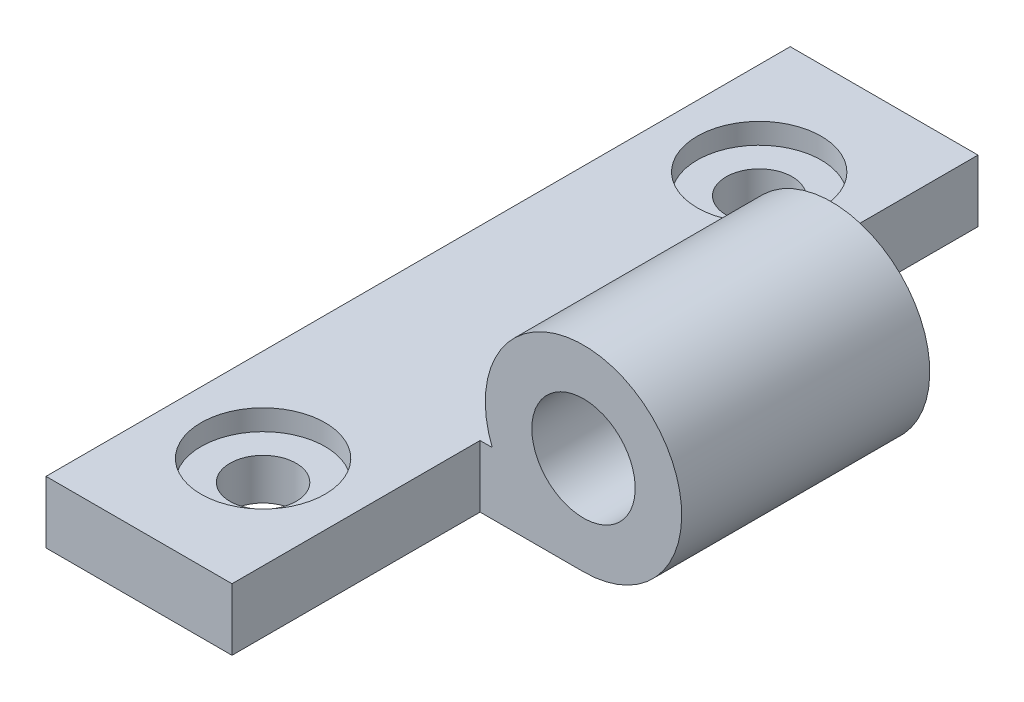
ISO-10303-21;
HEADER;
FILE_DESCRIPTION(('STEP AP214'),'2;1');
FILE_NAME('part.step','',(''),(''),'','','');
FILE_SCHEMA(('AUTOMOTIVE_DESIGN { 1 0 10303 214 1 1 1 1 }'));
ENDSEC;
DATA;
#1=APPLICATION_CONTEXT('core data for automotive mechanical design processes');
#2=APPLICATION_PROTOCOL_DEFINITION('international standard','automotive_design',2000,#1);
#3=PRODUCT_CONTEXT('',#1,'mechanical');
#4=PRODUCT('Part','Part','',(#3));
#5=PRODUCT_RELATED_PRODUCT_CATEGORY('part','',(#4));
#6=PRODUCT_DEFINITION_FORMATION('','',#4);
#7=PRODUCT_DEFINITION_CONTEXT('part definition',#1,'design');
#8=PRODUCT_DEFINITION('design','',#6,#7);
#9=PRODUCT_DEFINITION_SHAPE('','',#8);
#10=(LENGTH_UNIT() NAMED_UNIT(*) SI_UNIT(.MILLI.,.METRE.));
#11=(NAMED_UNIT(*) PLANE_ANGLE_UNIT() SI_UNIT($,.RADIAN.));
#12=(NAMED_UNIT(*) SI_UNIT($,.STERADIAN.) SOLID_ANGLE_UNIT());
#13=UNCERTAINTY_MEASURE_WITH_UNIT(LENGTH_MEASURE(1.E-05),#10,'distance_accuracy_value','');
#14=(GEOMETRIC_REPRESENTATION_CONTEXT(3) GLOBAL_UNCERTAINTY_ASSIGNED_CONTEXT((#13)) GLOBAL_UNIT_ASSIGNED_CONTEXT((#10,
#11,#12)) REPRESENTATION_CONTEXT('',''));
#15=CARTESIAN_POINT('',(0.,0.,0.));
#16=DIRECTION('',(0.,0.,1.));
#17=DIRECTION('',(1.,0.,0.));
#18=AXIS2_PLACEMENT_3D('',#15,#16,#17);
#19=CARTESIAN_POINT('',(0.,3.,0.));
#20=DIRECTION('',(0.,1.,0.));
#21=DIRECTION('',(0.,0.,1.));
#22=AXIS2_PLACEMENT_3D('',#19,#20,#21);
#23=PLANE('',#22);
#24=DIRECTION('',(0.,0.,1.));
#25=VECTOR('',#24,1.);
#26=CARTESIAN_POINT('',(8.99755402302062,3.,0.));
#27=LINE('',#26,#25);
#28=CARTESIAN_POINT('',(8.99755402302062,3.,24.));
#29=VERTEX_POINT('',#28);
#30=CARTESIAN_POINT('',(8.99755402302062,3.,36.));
#31=VERTEX_POINT('',#30);
#32=EDGE_CURVE('E132',#29,#31,#27,.T.);
#33=ORIENTED_EDGE('',*,*,#32,.F.);
#34=DIRECTION('',(-1.,0.,0.));
#35=VECTOR('',#34,1.);
#36=CARTESIAN_POINT('',(0.,3.,24.));
#37=LINE('',#36,#35);
#38=CARTESIAN_POINT('',(9.58411956683608,3.,24.));
#39=VERTEX_POINT('',#38);
#40=EDGE_CURVE('E121',#39,#29,#37,.T.);
#41=ORIENTED_EDGE('',*,*,#40,.F.);
#42=DIRECTION('',(0.,0.,-1.));
#43=VECTOR('',#42,1.);
#44=CARTESIAN_POINT('',(9.58411956683608,3.,24.));
#45=LINE('',#44,#43);
#46=CARTESIAN_POINT('',(9.58411956683608,3.,12.));
#47=VERTEX_POINT('',#46);
#48=EDGE_CURVE('E162',#47,#39,#45,.F.);
#49=ORIENTED_EDGE('',*,*,#48,.F.);
#50=DIRECTION('',(1.,0.,0.));
#51=VECTOR('',#50,1.);
#52=CARTESIAN_POINT('',(0.,3.,12.));
#53=LINE('',#52,#51);
#54=CARTESIAN_POINT('',(9.08281417427322,3.,12.));
#55=VERTEX_POINT('',#54);
#56=EDGE_CURVE('E149',#55,#47,#53,.T.);
#57=ORIENTED_EDGE('',*,*,#56,.F.);
#58=DIRECTION('',(0.,0.,1.));
#59=VECTOR('',#58,1.);
#60=CARTESIAN_POINT('',(9.08281417427322,3.,0.));
#61=LINE('',#60,#59);
#62=CARTESIAN_POINT('',(9.08281417427322,3.,0.));
#63=VERTEX_POINT('',#62);
#64=EDGE_CURVE('E155',#63,#55,#61,.T.);
#65=ORIENTED_EDGE('',*,*,#64,.F.);
#66=DIRECTION('',(-1.,0.,0.));
#67=VECTOR('',#66,1.);
#68=CARTESIAN_POINT('',(0.,3.,0.));
#69=LINE('',#68,#67);
#70=CARTESIAN_POINT('',(0.,3.,0.));
#71=VERTEX_POINT('',#70);
#72=EDGE_CURVE('E67',#63,#71,#69,.T.);
#73=ORIENTED_EDGE('',*,*,#72,.T.);
#74=DIRECTION('',(0.,0.,1.));
#75=VECTOR('',#74,1.);
#76=CARTESIAN_POINT('',(0.,3.,0.));
#77=LINE('',#76,#75);
#78=CARTESIAN_POINT('',(0.,3.,36.));
#79=VERTEX_POINT('',#78);
#80=EDGE_CURVE('E178',#71,#79,#77,.T.);
#81=ORIENTED_EDGE('',*,*,#80,.T.);
#82=DIRECTION('',(1.,0.,0.));
#83=VECTOR('',#82,1.);
#84=CARTESIAN_POINT('',(0.,3.,36.));
#85=LINE('',#84,#83);
#86=EDGE_CURVE('E142',#79,#31,#85,.T.);
#87=ORIENTED_EDGE('',*,*,#86,.T.);
#88=EDGE_LOOP('',(#33,#41,#49,#57,#65,#73,#81,#87));
#89=FACE_BOUND('',#88,.T.);
#90=CARTESIAN_POINT('',(4.5,3.,6.));
#91=DIRECTION('',(0.,1.,0.));
#92=DIRECTION('',(0.,0.,1.));
#93=AXIS2_PLACEMENT_3D('',#90,#91,#92);
#94=CIRCLE('',#93,3.);
#95=CARTESIAN_POINT('',(4.5,3.,9.));
#96=VERTEX_POINT('',#95);
#97=EDGE_CURVE('E170',#96,#96,#94,.T.);
#98=ORIENTED_EDGE('',*,*,#97,.F.);
#99=EDGE_LOOP('',(#98));
#100=FACE_BOUND('',#99,.T.);
#101=CARTESIAN_POINT('',(4.5,3.,30.));
#102=DIRECTION('',(0.,1.,0.));
#103=DIRECTION('',(0.,0.,1.));
#104=AXIS2_PLACEMENT_3D('',#101,#102,#103);
#105=CIRCLE('',#104,3.);
#106=CARTESIAN_POINT('',(4.5,3.,33.));
#107=VERTEX_POINT('',#106);
#108=EDGE_CURVE('E165',#107,#107,#105,.T.);
#109=ORIENTED_EDGE('',*,*,#108,.F.);
#110=EDGE_LOOP('',(#109));
#111=FACE_BOUND('',#110,.T.);
#112=ADVANCED_FACE('F50',(#89,#100,#111),#23,.T.);
#113=CARTESIAN_POINT('',(4.5,-7.00000000000003,30.));
#114=DIRECTION('',(0.,1.,0.));
#115=DIRECTION('',(0.,0.,1.));
#116=AXIS2_PLACEMENT_3D('',#113,#114,#115);
#117=CYLINDRICAL_SURFACE('',#116,1.6);
#118=CARTESIAN_POINT('',(4.5,0.,30.));
#119=DIRECTION('',(0.,1.,0.));
#120=DIRECTION('',(0.,0.,1.));
#121=AXIS2_PLACEMENT_3D('',#118,#119,#120);
#122=CIRCLE('',#121,1.6);
#123=CARTESIAN_POINT('',(4.5,0.,31.6));
#124=VERTEX_POINT('',#123);
#125=EDGE_CURVE('E198',#124,#124,#122,.T.);
#126=ORIENTED_EDGE('',*,*,#125,.F.);
#127=EDGE_LOOP('',(#126));
#128=FACE_BOUND('',#127,.T.);
#129=CARTESIAN_POINT('',(4.5,2.,30.));
#130=DIRECTION('',(0.,1.,0.));
#131=DIRECTION('',(0.,0.,1.));
#132=AXIS2_PLACEMENT_3D('',#129,#130,#131);
#133=CIRCLE('',#132,1.6);
#134=CARTESIAN_POINT('',(4.5,2.,31.6));
#135=VERTEX_POINT('',#134);
#136=EDGE_CURVE('E201',#135,#135,#133,.F.);
#137=ORIENTED_EDGE('',*,*,#136,.F.);
#138=EDGE_LOOP('',(#137));
#139=FACE_BOUND('',#138,.T.);
#140=ADVANCED_FACE('F247',(#128,#139),#117,.F.);
#141=CARTESIAN_POINT('',(4.5,-7.00000000000003,6.));
#142=DIRECTION('',(0.,1.,0.));
#143=DIRECTION('',(0.,0.,1.));
#144=AXIS2_PLACEMENT_3D('',#141,#142,#143);
#145=CYLINDRICAL_SURFACE('',#144,1.6);
#146=CARTESIAN_POINT('',(4.5,0.,6.));
#147=DIRECTION('',(0.,1.,0.));
#148=DIRECTION('',(0.,0.,1.));
#149=AXIS2_PLACEMENT_3D('',#146,#147,#148);
#150=CIRCLE('',#149,1.6);
#151=CARTESIAN_POINT('',(4.5,0.,7.6));
#152=VERTEX_POINT('',#151);
#153=EDGE_CURVE('E187',#152,#152,#150,.T.);
#154=ORIENTED_EDGE('',*,*,#153,.F.);
#155=EDGE_LOOP('',(#154));
#156=FACE_BOUND('',#155,.T.);
#157=CARTESIAN_POINT('',(4.5,2.,6.));
#158=DIRECTION('',(0.,1.,0.));
#159=DIRECTION('',(0.,0.,1.));
#160=AXIS2_PLACEMENT_3D('',#157,#158,#159);
#161=CIRCLE('',#160,1.6);
#162=CARTESIAN_POINT('',(4.5,2.,7.6));
#163=VERTEX_POINT('',#162);
#164=EDGE_CURVE('E169',#163,#163,#161,.F.);
#165=ORIENTED_EDGE('',*,*,#164,.F.);
#166=EDGE_LOOP('',(#165));
#167=FACE_BOUND('',#166,.T.);
#168=ADVANCED_FACE('F252',(#156,#167),#145,.F.);
#169=CARTESIAN_POINT('',(0.,3.,0.));
#170=DIRECTION('',(1.,0.,0.));
#171=DIRECTION('',(0.,0.,-1.));
#172=AXIS2_PLACEMENT_3D('',#169,#170,#171);
#173=PLANE('',#172);
#174=DIRECTION('',(0.,0.,1.));
#175=VECTOR('',#174,1.);
#176=CARTESIAN_POINT('',(0.,0.,0.));
#177=LINE('',#176,#175);
#178=CARTESIAN_POINT('',(0.,0.,0.));
#179=VERTEX_POINT('',#178);
#180=CARTESIAN_POINT('',(0.,0.,36.));
#181=VERTEX_POINT('',#180);
#182=EDGE_CURVE('E184',#179,#181,#177,.T.);
#183=ORIENTED_EDGE('',*,*,#182,.T.);
#184=DIRECTION('',(0.,-1.,0.));
#185=VECTOR('',#184,1.);
#186=CARTESIAN_POINT('',(0.,3.,36.));
#187=LINE('',#186,#185);
#188=EDGE_CURVE('E195',#79,#181,#187,.T.);
#189=ORIENTED_EDGE('',*,*,#188,.F.);
#190=ORIENTED_EDGE('',*,*,#80,.F.);
#191=DIRECTION('',(0.,-1.,0.));
#192=VECTOR('',#191,1.);
#193=CARTESIAN_POINT('',(0.,3.,0.));
#194=LINE('',#193,#192);
#195=EDGE_CURVE('E183',#71,#179,#194,.T.);
#196=ORIENTED_EDGE('',*,*,#195,.T.);
#197=EDGE_LOOP('',(#183,#189,#190,#196));
#198=FACE_BOUND('',#197,.T.);
#199=ADVANCED_FACE('F52',(#198),#173,.F.);
#200=CARTESIAN_POINT('',(0.,3.,36.));
#201=DIRECTION('',(0.,0.,-1.));
#202=DIRECTION('',(-1.,0.,0.));
#203=AXIS2_PLACEMENT_3D('',#200,#201,#202);
#204=PLANE('',#203);
#205=DIRECTION('',(1.,0.,0.));
#206=VECTOR('',#205,1.);
#207=CARTESIAN_POINT('',(0.,0.,36.));
#208=LINE('',#207,#206);
#209=CARTESIAN_POINT('',(8.99755402302062,0.,36.));
#210=VERTEX_POINT('',#209);
#211=EDGE_CURVE('E78',#181,#210,#208,.T.);
#212=ORIENTED_EDGE('',*,*,#211,.T.);
#213=DIRECTION('',(0.,-1.,0.));
#214=VECTOR('',#213,1.);
#215=CARTESIAN_POINT('',(8.99755402302062,4.60957170836924,36.));
#216=LINE('',#215,#214);
#217=EDGE_CURVE('E138',#31,#210,#216,.T.);
#218=ORIENTED_EDGE('',*,*,#217,.F.);
#219=ORIENTED_EDGE('',*,*,#86,.F.);
#220=ORIENTED_EDGE('',*,*,#188,.T.);
#221=EDGE_LOOP('',(#212,#218,#219,#220));
#222=FACE_BOUND('',#221,.T.);
#223=ADVANCED_FACE('F221',(#222),#204,.F.);
#224=CARTESIAN_POINT('',(0.,3.,0.));
#225=DIRECTION('',(0.,0.,1.));
#226=DIRECTION('',(1.,0.,0.));
#227=AXIS2_PLACEMENT_3D('',#224,#225,#226);
#228=PLANE('',#227);
#229=ORIENTED_EDGE('',*,*,#72,.F.);
#230=DIRECTION('',(0.,1.,0.));
#231=VECTOR('',#230,1.);
#232=CARTESIAN_POINT('',(9.08281417427322,-1.93524382816757,0.));
#233=LINE('',#232,#231);
#234=CARTESIAN_POINT('',(9.08281417427322,0.,0.));
#235=VERTEX_POINT('',#234);
#236=EDGE_CURVE('E87',#235,#63,#233,.T.);
#237=ORIENTED_EDGE('',*,*,#236,.F.);
#238=DIRECTION('',(-1.,0.,0.));
#239=VECTOR('',#238,1.);
#240=CARTESIAN_POINT('',(0.,0.,0.));
#241=LINE('',#240,#239);
#242=EDGE_CURVE('E180',#235,#179,#241,.T.);
#243=ORIENTED_EDGE('',*,*,#242,.T.);
#244=ORIENTED_EDGE('',*,*,#195,.F.);
#245=EDGE_LOOP('',(#229,#237,#243,#244));
#246=FACE_BOUND('',#245,.T.);
#247=ADVANCED_FACE('F216',(#246),#228,.F.);
#248=CARTESIAN_POINT('',(0.,0.,0.));
#249=DIRECTION('',(0.,1.,0.));
#250=DIRECTION('',(0.,0.,1.));
#251=AXIS2_PLACEMENT_3D('',#248,#249,#250);
#252=PLANE('',#251);
#253=ORIENTED_EDGE('',*,*,#153,.T.);
#254=EDGE_LOOP('',(#253));
#255=FACE_BOUND('',#254,.T.);
#256=ORIENTED_EDGE('',*,*,#125,.T.);
#257=EDGE_LOOP('',(#256));
#258=FACE_BOUND('',#257,.T.);
#259=DIRECTION('',(-1.,0.,0.));
#260=VECTOR('',#259,1.);
#261=CARTESIAN_POINT('',(0.,0.,24.));
#262=LINE('',#261,#260);
#263=CARTESIAN_POINT('',(14.,0.,24.));
#264=VERTEX_POINT('',#263);
#265=CARTESIAN_POINT('',(8.99755402302062,0.,24.));
#266=VERTEX_POINT('',#265);
#267=EDGE_CURVE('E133',#264,#266,#262,.T.);
#268=ORIENTED_EDGE('',*,*,#267,.T.);
#269=DIRECTION('',(0.,0.,1.));
#270=VECTOR('',#269,1.);
#271=CARTESIAN_POINT('',(8.99755402302062,0.,0.));
#272=LINE('',#271,#270);
#273=EDGE_CURVE('E13',#266,#210,#272,.T.);
#274=ORIENTED_EDGE('',*,*,#273,.T.);
#275=ORIENTED_EDGE('',*,*,#211,.F.);
#276=ORIENTED_EDGE('',*,*,#182,.F.);
#277=ORIENTED_EDGE('',*,*,#242,.F.);
#278=DIRECTION('',(0.,0.,1.));
#279=VECTOR('',#278,1.);
#280=CARTESIAN_POINT('',(9.08281417427322,0.,0.));
#281=LINE('',#280,#279);
#282=CARTESIAN_POINT('',(9.08281417427322,0.,12.));
#283=VERTEX_POINT('',#282);
#284=EDGE_CURVE('E59',#235,#283,#281,.T.);
#285=ORIENTED_EDGE('',*,*,#284,.T.);
#286=DIRECTION('',(1.,0.,0.));
#287=VECTOR('',#286,1.);
#288=CARTESIAN_POINT('',(0.,0.,12.));
#289=LINE('',#288,#287);
#290=CARTESIAN_POINT('',(14.,0.,12.));
#291=VERTEX_POINT('',#290);
#292=EDGE_CURVE('E152',#283,#291,#289,.T.);
#293=ORIENTED_EDGE('',*,*,#292,.T.);
#294=DIRECTION('',(0.,0.,-1.));
#295=VECTOR('',#294,1.);
#296=CARTESIAN_POINT('',(14.,0.,0.));
#297=LINE('',#296,#295);
#298=EDGE_CURVE('E189',#264,#291,#297,.T.);
#299=ORIENTED_EDGE('',*,*,#298,.F.);
#300=EDGE_LOOP('',(#268,#274,#275,#276,#277,#285,#293,#299));
#301=FACE_BOUND('',#300,.T.);
#302=ADVANCED_FACE('F211',(#255,#258,#301),#252,.F.);
#303=CARTESIAN_POINT('',(4.5,2.,6.));
#304=DIRECTION('',(0.,1.,0.));
#305=DIRECTION('',(0.,0.,1.));
#306=AXIS2_PLACEMENT_3D('',#303,#304,#305);
#307=PLANE('',#306);
#308=CARTESIAN_POINT('',(4.5,2.,6.));
#309=DIRECTION('',(0.,1.,0.));
#310=DIRECTION('',(0.,0.,1.));
#311=AXIS2_PLACEMENT_3D('',#308,#309,#310);
#312=CIRCLE('',#311,3.);
#313=CARTESIAN_POINT('',(4.5,2.,9.));
#314=VERTEX_POINT('',#313);
#315=EDGE_CURVE('E166',#314,#314,#312,.T.);
#316=ORIENTED_EDGE('',*,*,#315,.T.);
#317=EDGE_LOOP('',(#316));
#318=FACE_BOUND('',#317,.T.);
#319=ORIENTED_EDGE('',*,*,#164,.T.);
#320=EDGE_LOOP('',(#319));
#321=FACE_BOUND('',#320,.T.);
#322=ADVANCED_FACE('F259',(#318,#321),#307,.T.);
#323=CARTESIAN_POINT('',(4.5,2.,6.));
#324=DIRECTION('',(0.,1.,0.));
#325=DIRECTION('',(0.,0.,1.));
#326=AXIS2_PLACEMENT_3D('',#323,#324,#325);
#327=CYLINDRICAL_SURFACE('',#326,3.);
#328=ORIENTED_EDGE('',*,*,#315,.F.);
#329=EDGE_LOOP('',(#328));
#330=FACE_BOUND('',#329,.T.);
#331=ORIENTED_EDGE('',*,*,#97,.T.);
#332=EDGE_LOOP('',(#331));
#333=FACE_BOUND('',#332,.T.);
#334=ADVANCED_FACE('F282',(#330,#333),#327,.F.);
#335=CARTESIAN_POINT('',(4.5,2.,30.));
#336=DIRECTION('',(0.,1.,0.));
#337=DIRECTION('',(0.,0.,1.));
#338=AXIS2_PLACEMENT_3D('',#335,#336,#337);
#339=PLANE('',#338);
#340=CARTESIAN_POINT('',(4.5,2.,30.));
#341=DIRECTION('',(0.,1.,0.));
#342=DIRECTION('',(0.,0.,1.));
#343=AXIS2_PLACEMENT_3D('',#340,#341,#342);
#344=CIRCLE('',#343,3.);
#345=CARTESIAN_POINT('',(4.5,2.,33.));
#346=VERTEX_POINT('',#345);
#347=EDGE_CURVE('E173',#346,#346,#344,.T.);
#348=ORIENTED_EDGE('',*,*,#347,.T.);
#349=EDGE_LOOP('',(#348));
#350=FACE_BOUND('',#349,.T.);
#351=ORIENTED_EDGE('',*,*,#136,.T.);
#352=EDGE_LOOP('',(#351));
#353=FACE_BOUND('',#352,.T.);
#354=ADVANCED_FACE('F278',(#350,#353),#339,.T.);
#355=CARTESIAN_POINT('',(4.5,2.,30.));
#356=DIRECTION('',(0.,1.,0.));
#357=DIRECTION('',(0.,0.,1.));
#358=AXIS2_PLACEMENT_3D('',#355,#356,#357);
#359=CYLINDRICAL_SURFACE('',#358,3.);
#360=ORIENTED_EDGE('',*,*,#347,.F.);
#361=EDGE_LOOP('',(#360));
#362=FACE_BOUND('',#361,.T.);
#363=ORIENTED_EDGE('',*,*,#108,.T.);
#364=EDGE_LOOP('',(#363));
#365=FACE_BOUND('',#364,.T.);
#366=ADVANCED_FACE('F275',(#362,#365),#359,.F.);
#367=CARTESIAN_POINT('',(14.,4.75,24.));
#368=DIRECTION('',(0.,0.,-1.));
#369=DIRECTION('',(-1.,0.,0.));
#370=AXIS2_PLACEMENT_3D('',#367,#368,#369);
#371=PLANE('',#370);
#372=ORIENTED_EDGE('',*,*,#267,.F.);
#373=CARTESIAN_POINT('',(14.,4.75,24.));
#374=DIRECTION('',(0.,0.,-1.));
#375=DIRECTION('',(-1.,0.,0.));
#376=AXIS2_PLACEMENT_3D('',#373,#374,#375);
#377=CIRCLE('',#376,4.75);
#378=EDGE_CURVE('E128',#39,#264,#377,.T.);
#379=ORIENTED_EDGE('',*,*,#378,.F.);
#380=ORIENTED_EDGE('',*,*,#40,.T.);
#381=DIRECTION('',(0.,-1.,0.));
#382=VECTOR('',#381,1.);
#383=CARTESIAN_POINT('',(8.99755402302062,4.60957170836924,24.));
#384=LINE('',#383,#382);
#385=EDGE_CURVE('E126',#29,#266,#384,.T.);
#386=ORIENTED_EDGE('',*,*,#385,.T.);
#387=EDGE_LOOP('',(#372,#379,#380,#386));
#388=FACE_BOUND('',#387,.T.);
#389=CARTESIAN_POINT('',(14.,4.75,24.));
#390=DIRECTION('',(0.,0.,-1.));
#391=DIRECTION('',(-1.,0.,0.));
#392=AXIS2_PLACEMENT_3D('',#389,#390,#391);
#393=CIRCLE('',#392,2.5);
#394=CARTESIAN_POINT('',(11.5,4.75,24.));
#395=VERTEX_POINT('',#394);
#396=EDGE_CURVE('E157',#395,#395,#393,.T.);
#397=ORIENTED_EDGE('',*,*,#396,.T.);
#398=EDGE_LOOP('',(#397));
#399=FACE_BOUND('',#398,.T.);
#400=ADVANCED_FACE('F124',(#388,#399),#371,.F.);
#401=CARTESIAN_POINT('',(14.,4.75,12.));
#402=DIRECTION('',(0.,0.,-1.));
#403=DIRECTION('',(-1.,0.,0.));
#404=AXIS2_PLACEMENT_3D('',#401,#402,#403);
#405=PLANE('',#404);
#406=ORIENTED_EDGE('',*,*,#56,.T.);
#407=CARTESIAN_POINT('',(14.,4.75,12.));
#408=DIRECTION('',(0.,0.,-1.));
#409=DIRECTION('',(-1.,0.,0.));
#410=AXIS2_PLACEMENT_3D('',#407,#408,#409);
#411=CIRCLE('',#410,4.75);
#412=EDGE_CURVE('E160',#47,#291,#411,.T.);
#413=ORIENTED_EDGE('',*,*,#412,.T.);
#414=ORIENTED_EDGE('',*,*,#292,.F.);
#415=DIRECTION('',(0.,1.,0.));
#416=VECTOR('',#415,1.);
#417=CARTESIAN_POINT('',(9.08281417427322,-1.93524382816757,12.));
#418=LINE('',#417,#416);
#419=EDGE_CURVE('E144',#283,#55,#418,.T.);
#420=ORIENTED_EDGE('',*,*,#419,.T.);
#421=EDGE_LOOP('',(#406,#413,#414,#420));
#422=FACE_BOUND('',#421,.T.);
#423=CARTESIAN_POINT('',(14.,4.75,12.));
#424=DIRECTION('',(0.,0.,-1.));
#425=DIRECTION('',(-1.,0.,0.));
#426=AXIS2_PLACEMENT_3D('',#423,#424,#425);
#427=CIRCLE('',#426,2.5);
#428=CARTESIAN_POINT('',(11.5,4.75,12.));
#429=VERTEX_POINT('',#428);
#430=EDGE_CURVE('E197',#429,#429,#427,.T.);
#431=ORIENTED_EDGE('',*,*,#430,.F.);
#432=EDGE_LOOP('',(#431));
#433=FACE_BOUND('',#432,.T.);
#434=ADVANCED_FACE('F228',(#422,#433),#405,.T.);
#435=CARTESIAN_POINT('',(14.,4.75,24.));
#436=DIRECTION('',(0.,0.,-1.));
#437=DIRECTION('',(-1.,0.,0.));
#438=AXIS2_PLACEMENT_3D('',#435,#436,#437);
#439=CYLINDRICAL_SURFACE('',#438,4.75);
#440=ORIENTED_EDGE('',*,*,#412,.F.);
#441=ORIENTED_EDGE('',*,*,#48,.T.);
#442=ORIENTED_EDGE('',*,*,#378,.T.);
#443=ORIENTED_EDGE('',*,*,#298,.T.);
#444=EDGE_LOOP('',(#440,#441,#442,#443));
#445=FACE_BOUND('',#444,.T.);
#446=ADVANCED_FACE('F225',(#445),#439,.T.);
#447=CARTESIAN_POINT('',(14.,4.75,24.));
#448=DIRECTION('',(0.,0.,-1.));
#449=DIRECTION('',(-1.,0.,0.));
#450=AXIS2_PLACEMENT_3D('',#447,#448,#449);
#451=CYLINDRICAL_SURFACE('',#450,2.5);
#452=ORIENTED_EDGE('',*,*,#396,.F.);
#453=EDGE_LOOP('',(#452));
#454=FACE_BOUND('',#453,.T.);
#455=ORIENTED_EDGE('',*,*,#430,.T.);
#456=EDGE_LOOP('',(#455));
#457=FACE_BOUND('',#456,.T.);
#458=ADVANCED_FACE('F234',(#454,#457),#451,.F.);
#459=CARTESIAN_POINT('',(9.08281417427322,-1.93524382816757,12.));
#460=DIRECTION('',(-1.,0.,0.));
#461=DIRECTION('',(0.,0.,1.));
#462=AXIS2_PLACEMENT_3D('',#459,#460,#461);
#463=PLANE('',#462);
#464=ORIENTED_EDGE('',*,*,#64,.T.);
#465=ORIENTED_EDGE('',*,*,#419,.F.);
#466=ORIENTED_EDGE('',*,*,#284,.F.);
#467=ORIENTED_EDGE('',*,*,#236,.T.);
#468=EDGE_LOOP('',(#464,#465,#466,#467));
#469=FACE_BOUND('',#468,.T.);
#470=ADVANCED_FACE('F214',(#469),#463,.F.);
#471=CARTESIAN_POINT('',(8.99755402302062,4.60957170836924,24.));
#472=DIRECTION('',(-1.,0.,0.));
#473=DIRECTION('',(0.,0.,1.));
#474=AXIS2_PLACEMENT_3D('',#471,#472,#473);
#475=PLANE('',#474);
#476=ORIENTED_EDGE('',*,*,#32,.T.);
#477=ORIENTED_EDGE('',*,*,#217,.T.);
#478=ORIENTED_EDGE('',*,*,#273,.F.);
#479=ORIENTED_EDGE('',*,*,#385,.F.);
#480=EDGE_LOOP('',(#476,#477,#478,#479));
#481=FACE_BOUND('',#480,.T.);
#482=ADVANCED_FACE('F136',(#481),#475,.F.);
#483=CLOSED_SHELL('',(#112,#140,#168,#199,#223,#247,#302,#322,#334,#354,#366,#400,#434,#446,
#458,#470,#482));
#484=MANIFOLD_SOLID_BREP('B2',#483);
#485=ADVANCED_BREP_SHAPE_REPRESENTATION('',(#18,#484),#14);
#486=SHAPE_DEFINITION_REPRESENTATION(#9,#485);
ENDSEC;
END-ISO-10303-21;
